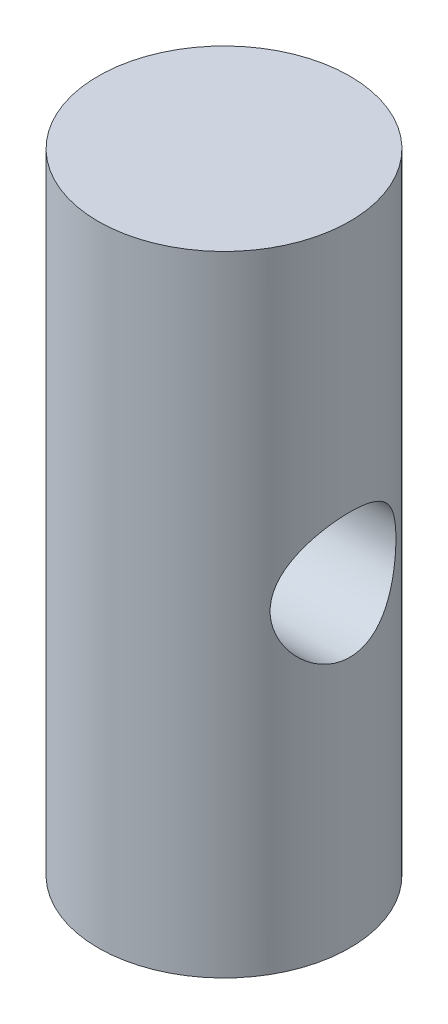
ISO-10303-21;
HEADER;
FILE_DESCRIPTION(('STEP AP214'),'2;1');
FILE_NAME('part.step','',(''),(''),'','','');
FILE_SCHEMA(('AUTOMOTIVE_DESIGN { 1 0 10303 214 1 1 1 1 }'));
ENDSEC;
DATA;
#1=APPLICATION_CONTEXT('core data for automotive mechanical design processes');
#2=APPLICATION_PROTOCOL_DEFINITION('international standard','automotive_design',2000,#1);
#3=PRODUCT_CONTEXT('',#1,'mechanical');
#4=PRODUCT('Part','Part','',(#3));
#5=PRODUCT_RELATED_PRODUCT_CATEGORY('part','',(#4));
#6=PRODUCT_DEFINITION_FORMATION('','',#4);
#7=PRODUCT_DEFINITION_CONTEXT('part definition',#1,'design');
#8=PRODUCT_DEFINITION('design','',#6,#7);
#9=PRODUCT_DEFINITION_SHAPE('','',#8);
#10=(LENGTH_UNIT() NAMED_UNIT(*) SI_UNIT(.MILLI.,.METRE.));
#11=(NAMED_UNIT(*) PLANE_ANGLE_UNIT() SI_UNIT($,.RADIAN.));
#12=(NAMED_UNIT(*) SI_UNIT($,.STERADIAN.) SOLID_ANGLE_UNIT());
#13=UNCERTAINTY_MEASURE_WITH_UNIT(LENGTH_MEASURE(1.E-05),#10,'distance_accuracy_value','');
#14=(GEOMETRIC_REPRESENTATION_CONTEXT(3) GLOBAL_UNCERTAINTY_ASSIGNED_CONTEXT((#13)) GLOBAL_UNIT_ASSIGNED_CONTEXT((#10,
#11,#12)) REPRESENTATION_CONTEXT('',''));
#15=CARTESIAN_POINT('',(0.,0.,0.));
#16=DIRECTION('',(0.,0.,1.));
#17=DIRECTION('',(1.,0.,0.));
#18=AXIS2_PLACEMENT_3D('',#15,#16,#17);
#19=CARTESIAN_POINT('',(0.,25.,0.));
#20=DIRECTION('',(0.,-1.,0.));
#21=DIRECTION('',(0.,0.,-1.));
#22=AXIS2_PLACEMENT_3D('',#19,#20,#21);
#23=CYLINDRICAL_SURFACE('',#22,5.);
#24=CARTESIAN_POINT('',(-5.,10.,0.));
#25=CARTESIAN_POINT('',(-4.99999177550472,10.000009669056,-0.131426682334305));
#26=CARTESIAN_POINT('',(-4.99476199135277,10.010425561774,-0.263015634437213));
#27=CARTESIAN_POINT('',(-4.9743541856102,10.0516318211621,-0.522301454622883));
#28=CARTESIAN_POINT('',(-4.9591572718767,10.082460880925,-0.649990448564105));
#29=CARTESIAN_POINT('',(-4.92040690922477,10.1629846227188,-0.897333631316203));
#30=CARTESIAN_POINT('',(-4.89688595907259,10.2126059877827,-1.01701694536277));
#31=CARTESIAN_POINT('',(-4.84364443325827,10.3289265262518,-1.24618160399671));
#32=CARTESIAN_POINT('',(-4.81392434644421,10.3956243531451,-1.3556637520377));
#33=CARTESIAN_POINT('',(-4.74890645050632,10.5487931316426,-1.56876952630998));
#34=CARTESIAN_POINT('',(-4.71337997659091,10.6362162002298,-1.67163802294308));
#35=CARTESIAN_POINT('',(-4.64149925776731,10.8263036959853,-1.86194861703333));
#36=CARTESIAN_POINT('',(-4.60514440566897,10.9289796288401,-1.94937895911555));
#37=CARTESIAN_POINT('',(-4.53247377945622,11.1562083744453,-2.11312999967247));
#38=CARTESIAN_POINT('',(-4.49637967412567,11.281840246035,-2.18806333849064));
#39=CARTESIAN_POINT('',(-4.43214946943555,11.5459183397954,-2.31542056761491));
#40=CARTESIAN_POINT('',(-4.40400769020792,11.6843553217626,-2.36786053751682));
#41=CARTESIAN_POINT('',(-4.36144667591402,11.9616627635964,-2.44533110537653));
#42=CARTESIAN_POINT('',(-4.34630678958452,12.1000111301796,-2.47181464267578));
#43=CARTESIAN_POINT('',(-4.3295472487215,12.3799470944376,-2.50106748329741));
#44=CARTESIAN_POINT('',(-4.3279142335843,12.5215313521751,-2.50386022093906));
#45=CARTESIAN_POINT('',(-4.33777325642937,12.7857150607909,-2.48671821792512));
#46=CARTESIAN_POINT('',(-4.34771909154984,12.9085600780583,-2.46946139884055));
#47=CARTESIAN_POINT('',(-4.37690571834675,13.1493047734319,-2.41734962264384));
#48=CARTESIAN_POINT('',(-4.39614947079454,13.2672028632631,-2.38248905974454));
#49=CARTESIAN_POINT('',(-4.44218691031839,13.4980728314143,-2.29552445096459));
#50=CARTESIAN_POINT('',(-4.46914601659993,13.6108659969645,-2.24303766778988));
#51=CARTESIAN_POINT('',(-4.52758510703513,13.826585731475,-2.12260421917012));
#52=CARTESIAN_POINT('',(-4.55906711950477,13.9295078390002,-2.0546506095312));
#53=CARTESIAN_POINT('',(-4.62782894758213,14.1363031318581,-1.89516513728194));
#54=CARTESIAN_POINT('',(-4.66533775591865,14.2386421839404,-1.8017361459232));
#55=CARTESIAN_POINT('',(-4.73869058251019,14.4268385464772,-1.59888894685344));
#56=CARTESIAN_POINT('',(-4.77453379897003,14.5126879800847,-1.48946314143572));
#57=CARTESIAN_POINT('',(-4.84254968207409,14.6692141525743,-1.25129126457962));
#58=CARTESIAN_POINT('',(-4.87447460405015,14.7390011811144,-1.12188397899853));
#59=CARTESIAN_POINT('',(-4.92894702803109,14.8552425726075,-0.851165538721987));
#60=CARTESIAN_POINT('',(-4.95150197358893,14.9017154625379,-0.709863940663163));
#61=CARTESIAN_POINT('',(-4.98310834353579,14.9661885092917,-0.431916229151782));
#62=CARTESIAN_POINT('',(-4.9931234575324,14.986228089367,-0.295853826370907));
#63=CARTESIAN_POINT('',(-5.00182533647794,15.0036618278362,-0.0219489998732895));
#64=CARTESIAN_POINT('',(-5.00051746803426,15.0010667140985,0.115892549675108));
#65=CARTESIAN_POINT('',(-4.98727980633468,14.9744832789533,0.378082429964655));
#66=CARTESIAN_POINT('',(-4.97618114219992,14.9521686681756,0.502648520123705));
#67=CARTESIAN_POINT('',(-4.94555428287529,14.8894048202616,0.74601723075597));
#68=CARTESIAN_POINT('',(-4.92602515837625,14.8489535838641,0.864819214231882));
#69=CARTESIAN_POINT('',(-4.87960628532329,14.7500038339196,1.09722152111965));
#70=CARTESIAN_POINT('',(-4.85252204417873,14.6910223747177,1.21057599249831));
#71=CARTESIAN_POINT('',(-4.7935993579975,14.5572311608752,1.42615340426439));
#72=CARTESIAN_POINT('',(-4.76175888940534,14.4824146634801,1.52837157450203));
#73=CARTESIAN_POINT('',(-4.69270553315087,14.3105989367091,1.72941922315487));
#74=CARTESIAN_POINT('',(-4.65527212009488,14.2121428290248,1.82693019428496));
#75=CARTESIAN_POINT('',(-4.58155978921587,14.0001871219506,2.0046408025722));
#76=CARTESIAN_POINT('',(-4.54528168472407,13.8866772029301,2.08482846428685));
#77=CARTESIAN_POINT('',(-4.4762798054528,13.6408908645153,2.22926978618995));
#78=CARTESIAN_POINT('',(-4.44381323981254,13.5079718347089,2.29256373922243));
#79=CARTESIAN_POINT('',(-4.38935180726746,13.2312248311175,2.39520706511459));
#80=CARTESIAN_POINT('',(-4.36734345549014,13.087411184,2.43458729077055));
#81=CARTESIAN_POINT('',(-4.33903752569351,12.8077244426371,2.48465421767005));
#82=CARTESIAN_POINT('',(-4.33143458674096,12.672414365881,2.4977324874436));
#83=CARTESIAN_POINT('',(-4.32913386592579,12.4013823326193,2.50172288950898));
#84=CARTESIAN_POINT('',(-4.3344304902511,12.2656605801264,2.49264462983266));
#85=CARTESIAN_POINT('',(-4.35594655164663,12.0112912443832,2.45481530197332));
#86=CARTESIAN_POINT('',(-4.37107736338133,11.8922488182792,2.42802074302696));
#87=CARTESIAN_POINT('',(-4.40927540337602,11.6604797078,2.35793843840544));
#88=CARTESIAN_POINT('',(-4.43234518434965,11.5477550684335,2.31464538728732));
#89=CARTESIAN_POINT('',(-4.48571326433413,11.3234378472803,2.20953919315538));
#90=CARTESIAN_POINT('',(-4.5163930799845,11.212430148265,2.14667719009403));
#91=CARTESIAN_POINT('',(-4.58088327077455,11.00181375676,2.0053780838799));
#92=CARTESIAN_POINT('',(-4.61469526970767,10.9022110373713,1.92693287765888));
#93=CARTESIAN_POINT('',(-4.68655816327011,10.7046446362504,1.74550556946066));
#94=CARTESIAN_POINT('',(-4.7246249151498,10.6083506358286,1.6407002246921));
#95=CARTESIAN_POINT('',(-4.79694347383545,10.434344150572,1.41539785420684));
#96=CARTESIAN_POINT('',(-4.83119321905446,10.3566416813941,1.29489242426332));
#97=CARTESIAN_POINT('',(-4.89245149457782,10.2219030205159,1.03978808878536));
#98=CARTESIAN_POINT('',(-4.91940711437488,10.1650168322156,0.905095560782289));
#99=CARTESIAN_POINT('',(-4.9517796092335,10.0978161412076,0.696328709257353));
#100=CARTESIAN_POINT('',(-4.96122314081874,10.0784446019982,0.62567041349409));
#101=CARTESIAN_POINT('',(-4.97717127275101,10.0459340516294,0.482623997839259));
#102=CARTESIAN_POINT('',(-4.98367766823159,10.0327912333237,0.410236963092403));
#103=CARTESIAN_POINT('',(-4.9923820076613,10.0152625277154,0.281518684621672));
#104=CARTESIAN_POINT('',(-4.99523288466454,10.0095450634687,0.225408499555445));
#105=CARTESIAN_POINT('',(-4.99904367329659,10.0019116705343,0.112875528456289));
#106=CARTESIAN_POINT('',(-5.00000353273198,9.99999584677452,0.0564527338382179));
#107=CARTESIAN_POINT('',(-5.,10.,0.));
#108=B_SPLINE_CURVE_WITH_KNOTS('',3,(#24,#25,#26,#27,#28,#29,#30,#31,#32,#33,#34,#35,#36,#37,
#38,#39,#40,#41,#42,#43,#44,#45,#46,#47,#48,#49,#50,#51,#52,#53,#54,#55,#56,#57,#58,#59,#60,#61,
#62,#63,#64,#65,#66,#67,#68,#69,#70,#71,#72,#73,#74,#75,#76,#77,#78,#79,#80,#81,#82,#83,#84,#85,
#86,#87,#88,#89,#90,#91,#92,#93,#94,#95,#96,#97,#98,#99,#100,#101,#102,#103,#104,#105,#106,
#107),.UNSPECIFIED.,.T.,.F.,(4,2,2,2,2,2,2,2,2,2,2,2,2,2,2,2,2,2,2,2,2,2,2,2,2,2,2,2,2,2,2,2,2,
2,2,2,2,2,2,2,2,4),(0.,0.394060643550731,0.788870374272994,1.18215538873075,1.57540940145392,
1.99245439679522,2.40981559413509,2.85954316076882,3.30894869745702,3.73145030350574,
4.15353393322551,4.52514281023301,4.89687009814196,5.27725600421218,5.65781303150554,
6.08662353334696,6.51563836496716,6.96457555536101,7.41315542280699,7.82458226178364,
8.2358141127869,8.61517266265305,8.99457304077329,9.38482140069747,9.77523626870848,
10.2039902661037,10.6330397153795,11.0828670540368,11.53211279863,11.9382326875699,
12.3441764966107,12.7114482562151,13.0788382197025,13.4709114195009,13.8631890285845,
14.303131068923,14.7433095845248,15.1866003415819,15.407934939208,15.6291340766843,
15.7983933645035,15.9676573239323),.UNSPECIFIED.);
#109=CARTESIAN_POINT('',(-5.,10.,0.));
#110=VERTEX_POINT('',#109);
#111=EDGE_CURVE('E10',#110,#110,#108,.T.);
#112=ORIENTED_EDGE('',*,*,#111,.T.);
#113=EDGE_LOOP('',(#112));
#114=FACE_BOUND('',#113,.T.);
#115=CARTESIAN_POINT('',(4.33012701892219,12.5,-2.5));
#116=CARTESIAN_POINT('',(4.33013982272992,12.3697334931235,-2.49998948436432));
#117=CARTESIAN_POINT('',(4.33609541965583,12.2392972793238,-2.48974954513168));
#118=CARTESIAN_POINT('',(4.35905877051907,11.9824310284708,-2.44930840724943));
#119=CARTESIAN_POINT('',(4.37608974726023,11.8560099959427,-2.41906526369545));
#120=CARTESIAN_POINT('',(4.41873376871659,11.6113710544389,-2.3402497699757));
#121=CARTESIAN_POINT('',(4.44430111338921,11.4931134264378,-2.29177485369963));
#122=CARTESIAN_POINT('',(4.50106659111455,11.2664394369055,-2.17816884056414));
#123=CARTESIAN_POINT('',(4.53226502875883,11.1580236082042,-2.11303684262671));
#124=CARTESIAN_POINT('',(4.59992173524851,10.9442356960831,-1.96166634317253));
#125=CARTESIAN_POINT('',(4.63660159331577,10.8398521655102,-1.87413008816917));
#126=CARTESIAN_POINT('',(4.70929956727453,10.6464790242868,-1.68313452122752));
#127=CARTESIAN_POINT('',(4.74531734512768,10.557497092245,-1.57966731506052));
#128=CARTESIAN_POINT('',(4.81553692452135,10.3915821235144,-1.35122390789082));
#129=CARTESIAN_POINT('',(4.84945266064072,10.3158655807209,-1.22526797235894));
#130=CARTESIAN_POINT('',(4.90876890230193,10.1871478665161,-0.960392566671147));
#131=CARTESIAN_POINT('',(4.93417477954535,10.1341323595615,-0.821481345389983));
#132=CARTESIAN_POINT('',(4.9720115311507,10.056238346836,-0.545112359773523));
#133=CARTESIAN_POINT('',(4.98523700553425,10.0296261841349,-0.408254476210983));
#134=CARTESIAN_POINT('',(5.00018959613973,9.99958470328871,-0.131426571755677));
#135=CARTESIAN_POINT('',(5.00192366961168,9.99614135800464,0.00854151460650822));
#136=CARTESIAN_POINT('',(4.99407454791405,10.0118666849314,0.274581311061964));
#137=CARTESIAN_POINT('',(4.98546239730476,10.0290950388045,0.400802997942672));
#138=CARTESIAN_POINT('',(4.95935613149294,10.0822021097602,0.64828442979511));
#139=CARTESIAN_POINT('',(4.94186135165964,10.1180822224402,0.769543802734626));
#140=CARTESIAN_POINT('',(4.89928958219156,10.2077064152249,1.00577347892407));
#141=CARTESIAN_POINT('',(4.87411103823003,10.2616907829303,1.120633558788));
#142=CARTESIAN_POINT('',(4.81844114966712,10.3856585405036,1.33994200378327));
#143=CARTESIAN_POINT('',(4.78794790393709,10.4556476582558,1.4443866220966));
#144=CARTESIAN_POINT('',(4.72110985998075,10.6172383788326,1.6504341522455));
#145=CARTESIAN_POINT('',(4.68448439995438,10.710257570815,1.75083518757341));
#146=CARTESIAN_POINT('',(4.61135851467029,10.9114743123254,1.93526092574445));
#147=CARTESIAN_POINT('',(4.57485820664072,11.0196834306852,2.01927302893558));
#148=CARTESIAN_POINT('',(4.50360390231212,11.2566204810602,2.17376333660553));
#149=CARTESIAN_POINT('',(4.46910799976769,11.3862150576355,2.24304328744513));
#150=CARTESIAN_POINT('',(4.4093862569644,11.6573441783975,2.35829778250308));
#151=CARTESIAN_POINT('',(4.38415075115168,11.7988660825439,2.40429664552722));
#152=CARTESIAN_POINT('',(4.34861589542586,12.078036278207,2.4679505275626));
#153=CARTESIAN_POINT('',(4.33729139621241,12.2151027976089,2.48756280529994));
#154=CARTESIAN_POINT('',(4.32794798404024,12.4910033537914,2.50379236652857));
#155=CARTESIAN_POINT('',(4.32991967223279,12.6298360727995,2.50042589328757));
#156=CARTESIAN_POINT('',(4.34585841351462,12.8891347964468,2.47259010835991));
#157=CARTESIAN_POINT('',(4.35848968766635,13.0099486277697,2.45046954178116));
#158=CARTESIAN_POINT('',(4.39235053878353,13.2459194656775,2.38924071158112));
#159=CARTESIAN_POINT('',(4.41358290012585,13.3610746268669,2.35012694655908));
#160=CARTESIAN_POINT('',(4.46340555199141,13.5885283272564,2.25411897151217));
#161=CARTESIAN_POINT('',(4.49229108107657,13.7004475421326,2.19648515923163));
#162=CARTESIAN_POINT('',(4.55390298743125,13.9136731788488,2.0657176600397));
#163=CARTESIAN_POINT('',(4.58663133387872,14.0149741087881,1.99257601083123));
#164=CARTESIAN_POINT('',(4.65719996140836,14.2174469188033,1.82209291799636));
#165=CARTESIAN_POINT('',(4.69516457885708,14.3169928767722,1.72286318078435));
#166=CARTESIAN_POINT('',(4.76835587444746,14.4985305950059,1.5085112384988));
#167=CARTESIAN_POINT('',(4.80358162519329,14.5805164256585,1.39338368664988));
#168=CARTESIAN_POINT('',(4.86853404227334,14.7264343147909,1.14633840638507));
#169=CARTESIAN_POINT('',(4.89809104179855,14.7898327952085,1.01405774389062));
#170=CARTESIAN_POINT('',(4.9470838739847,14.892844759962,0.738805911647332));
#171=CARTESIAN_POINT('',(4.96652859191746,14.9324791296051,0.595844253647067));
#172=CARTESIAN_POINT('',(4.99168770453968,14.9834214093564,0.317449205674706));
#173=CARTESIAN_POINT('',(4.99849819767838,14.9969946858303,0.182528609085377));
#174=CARTESIAN_POINT('',(5.00105325940467,15.0021081674946,-0.0878149643374304));
#175=CARTESIAN_POINT('',(4.99680170177042,14.9936560856611,-0.223237748727016));
#176=CARTESIAN_POINT('',(4.97834922085637,14.9564589696045,-0.481344982671073));
#177=CARTESIAN_POINT('',(4.96482236636807,14.9290878283637,-0.604280801321773));
#178=CARTESIAN_POINT('',(4.92980234191731,14.8566825502417,-0.843614873664456));
#179=CARTESIAN_POINT('',(4.90830802955518,14.8116458803664,-0.960012187087214));
#180=CARTESIAN_POINT('',(4.85814826741488,14.7031821812607,-1.18855854199593));
#181=CARTESIAN_POINT('',(4.82921542506803,14.6390509753102,-1.30031295715363));
#182=CARTESIAN_POINT('',(4.76720333344986,14.4951058898524,-1.51193650408535));
#183=CARTESIAN_POINT('',(4.73412218229104,14.4152848073731,-1.61180014305397));
#184=CARTESIAN_POINT('',(4.66321523550925,14.2330042055506,-1.8072854232437));
#185=CARTESIAN_POINT('',(4.62524489658367,14.1290822739993,-1.90149582349002));
#186=CARTESIAN_POINT('',(4.55157698284941,13.9063847146178,-2.07165660492503));
#187=CARTESIAN_POINT('',(4.51588143910584,13.7875960858008,-2.1475908315154));
#188=CARTESIAN_POINT('',(4.44998982823926,13.5333638823357,-2.28108393396029));
#189=CARTESIAN_POINT('',(4.42000320346984,13.3975126115754,-2.3379862797745));
#190=CARTESIAN_POINT('',(4.38370272660093,13.1867773504802,-2.40494911880459));
#191=CARTESIAN_POINT('',(4.37305486646054,13.1154402243024,-2.42419582683991));
#192=CARTESIAN_POINT('',(4.35507574170935,12.9709593031507,-2.45635087255789));
#193=CARTESIAN_POINT('',(4.34774215854234,12.8978168090456,-2.46926364179176));
#194=CARTESIAN_POINT('',(4.3382377954292,12.7704990134531,-2.48591166201423));
#195=CARTESIAN_POINT('',(4.33520487024791,12.7165836784878,-2.49118864979202));
#196=CARTESIAN_POINT('',(4.33114674911323,12.6084553836896,-2.49823512543933));
#197=CARTESIAN_POINT('',(4.33012168747261,12.5542424041895,-2.50000437866474));
#198=CARTESIAN_POINT('',(4.33012701892219,12.5,-2.5));
#199=B_SPLINE_CURVE_WITH_KNOTS('',3,(#115,#116,#117,#118,#119,#120,#121,#122,#123,#124,#125,
#126,#127,#128,#129,#130,#131,#132,#133,#134,#135,#136,#137,#138,#139,#140,#141,#142,#143,#144,
#145,#146,#147,#148,#149,#150,#151,#152,#153,#154,#155,#156,#157,#158,#159,#160,#161,#162,#163,
#164,#165,#166,#167,#168,#169,#170,#171,#172,#173,#174,#175,#176,#177,#178,#179,#180,#181,#182,
#183,#184,#185,#186,#187,#188,#189,#190,#191,#192,#193,#194,#195,#196,#197,#198),.UNSPECIFIED.,
.T.,.F.,(4,2,2,2,2,2,2,2,2,2,2,2,2,2,2,2,2,2,2,2,2,2,2,2,2,2,2,2,2,2,2,2,2,2,2,2,2,2,2,2,2,4),
(0.,0.39058030648679,0.781982232062012,1.17132148982692,1.56068181366371,1.98215578129642,
2.40383927716011,2.85394730601992,3.30377067414811,3.72158712424921,4.13915059220183,
4.52040243716429,4.90168281298721,5.2882383683295,5.67493248380763,6.0981797864731,
6.5217512061988,6.97222104328704,7.42221935534346,7.83655727140613,8.25060232976016,
8.61935458565147,8.98822631095241,9.37418241020302,9.76033715555202,10.1951685895662,
10.6301466245059,11.076604535375,11.5226694952701,11.927806759788,12.3328021699001,
12.7111106218382,13.0894733378512,13.4840187680376,13.8787457525688,14.3127560463025,
14.7471485711797,15.195268726016,15.4189244153949,15.6424233996907,15.8050484542806,
15.9676843870379),.UNSPECIFIED.);
#200=CARTESIAN_POINT('',(4.33012701892219,12.5,-2.5));
#201=VERTEX_POINT('',#200);
#202=EDGE_CURVE('E53',#201,#201,#199,.T.);
#203=ORIENTED_EDGE('',*,*,#202,.T.);
#204=EDGE_LOOP('',(#203));
#205=FACE_BOUND('',#204,.T.);
#206=CARTESIAN_POINT('',(0.,25.,0.));
#207=DIRECTION('',(0.,1.,0.));
#208=DIRECTION('',(0.,0.,1.));
#209=AXIS2_PLACEMENT_3D('',#206,#207,#208);
#210=CIRCLE('',#209,5.);
#211=CARTESIAN_POINT('',(0.,25.,5.));
#212=VERTEX_POINT('',#211);
#213=EDGE_CURVE('E58',#212,#212,#210,.T.);
#214=ORIENTED_EDGE('',*,*,#213,.F.);
#215=EDGE_LOOP('',(#214));
#216=FACE_BOUND('',#215,.T.);
#217=CARTESIAN_POINT('',(0.,0.,0.));
#218=DIRECTION('',(0.,1.,0.));
#219=DIRECTION('',(0.,0.,1.));
#220=AXIS2_PLACEMENT_3D('',#217,#218,#219);
#221=CIRCLE('',#220,5.);
#222=CARTESIAN_POINT('',(0.,0.,5.));
#223=VERTEX_POINT('',#222);
#224=EDGE_CURVE('E63',#223,#223,#221,.T.);
#225=ORIENTED_EDGE('',*,*,#224,.T.);
#226=EDGE_LOOP('',(#225));
#227=FACE_BOUND('',#226,.T.);
#228=ADVANCED_FACE('F41',(#114,#205,#216,#227),#23,.T.);
#229=CARTESIAN_POINT('',(0.,25.,0.));
#230=DIRECTION('',(0.,1.,0.));
#231=DIRECTION('',(0.,0.,1.));
#232=AXIS2_PLACEMENT_3D('',#229,#230,#231);
#233=PLANE('',#232);
#234=ORIENTED_EDGE('',*,*,#213,.T.);
#235=EDGE_LOOP('',(#234));
#236=FACE_BOUND('',#235,.T.);
#237=ADVANCED_FACE('F75',(#236),#233,.T.);
#238=CARTESIAN_POINT('',(0.,0.,0.));
#239=DIRECTION('',(0.,1.,0.));
#240=DIRECTION('',(0.,0.,1.));
#241=AXIS2_PLACEMENT_3D('',#238,#239,#240);
#242=PLANE('',#241);
#243=ORIENTED_EDGE('',*,*,#224,.F.);
#244=EDGE_LOOP('',(#243));
#245=FACE_BOUND('',#244,.T.);
#246=ADVANCED_FACE('F73',(#245),#242,.F.);
#247=CARTESIAN_POINT('',(-5.,12.5,0.));
#248=DIRECTION('',(1.,0.,0.));
#249=DIRECTION('',(0.,0.,-1.));
#250=AXIS2_PLACEMENT_3D('',#247,#248,#249);
#251=CYLINDRICAL_SURFACE('',#250,2.5);
#252=ORIENTED_EDGE('',*,*,#202,.F.);
#253=EDGE_LOOP('',(#252));
#254=FACE_BOUND('',#253,.T.);
#255=ORIENTED_EDGE('',*,*,#111,.F.);
#256=EDGE_LOOP('',(#255));
#257=FACE_BOUND('',#256,.T.);
#258=ADVANCED_FACE('F69',(#254,#257),#251,.F.);
#259=CLOSED_SHELL('',(#228,#237,#246,#258));
#260=MANIFOLD_SOLID_BREP('B2',#259);
#261=ADVANCED_BREP_SHAPE_REPRESENTATION('',(#18,#260),#14);
#262=SHAPE_DEFINITION_REPRESENTATION(#9,#261);
ENDSEC;
END-ISO-10303-21;
